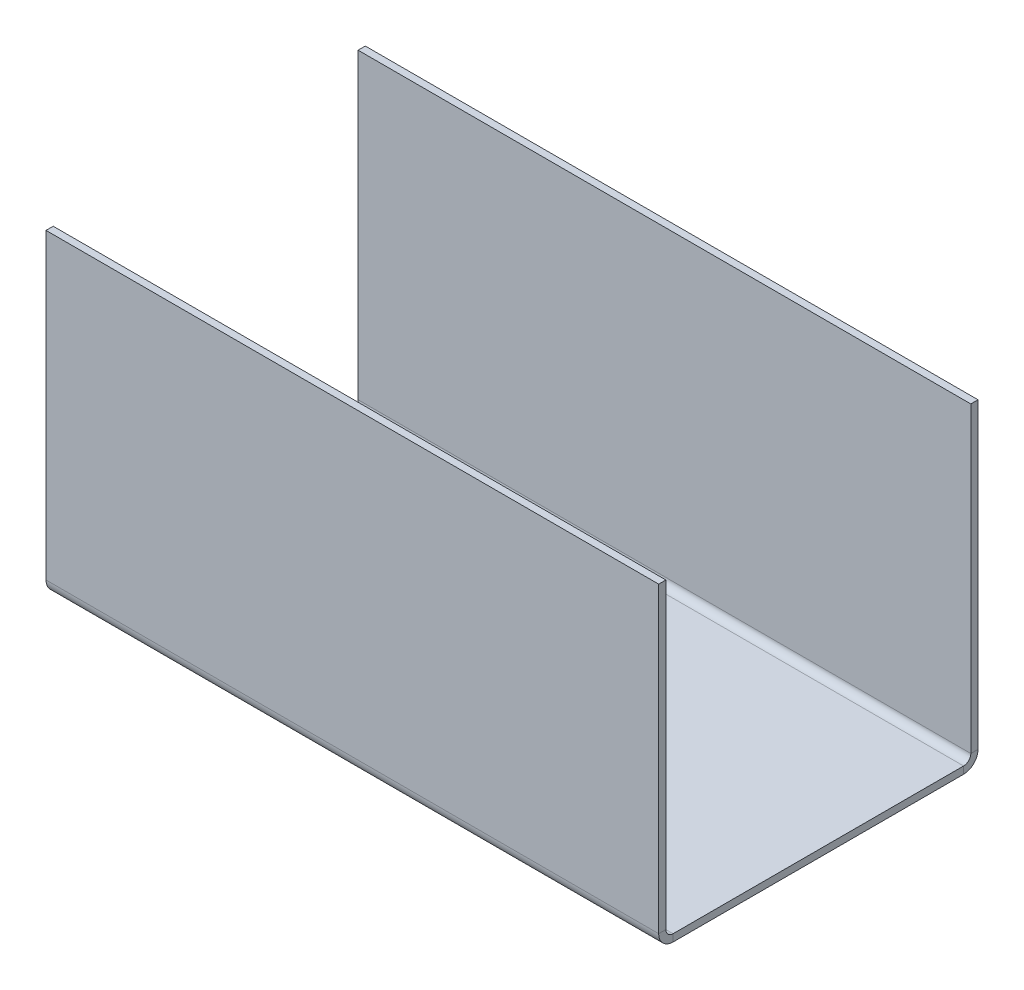
ISO-10303-21;
HEADER;
FILE_DESCRIPTION(('STEP AP214'),'2;1');
FILE_NAME('part.step','',(''),(''),'','','');
FILE_SCHEMA(('AUTOMOTIVE_DESIGN { 1 0 10303 214 1 1 1 1 }'));
ENDSEC;
DATA;
#1=APPLICATION_CONTEXT('core data for automotive mechanical design processes');
#2=APPLICATION_PROTOCOL_DEFINITION('international standard','automotive_design',2000,#1);
#3=PRODUCT_CONTEXT('',#1,'mechanical');
#4=PRODUCT('Part','Part','',(#3));
#5=PRODUCT_RELATED_PRODUCT_CATEGORY('part','',(#4));
#6=PRODUCT_DEFINITION_FORMATION('','',#4);
#7=PRODUCT_DEFINITION_CONTEXT('part definition',#1,'design');
#8=PRODUCT_DEFINITION('design','',#6,#7);
#9=PRODUCT_DEFINITION_SHAPE('','',#8);
#10=(LENGTH_UNIT() NAMED_UNIT(*) SI_UNIT(.MILLI.,.METRE.));
#11=(NAMED_UNIT(*) PLANE_ANGLE_UNIT() SI_UNIT($,.RADIAN.));
#12=(NAMED_UNIT(*) SI_UNIT($,.STERADIAN.) SOLID_ANGLE_UNIT());
#13=UNCERTAINTY_MEASURE_WITH_UNIT(LENGTH_MEASURE(1.E-05),#10,'distance_accuracy_value','');
#14=(GEOMETRIC_REPRESENTATION_CONTEXT(3) GLOBAL_UNCERTAINTY_ASSIGNED_CONTEXT((#13)) GLOBAL_UNIT_ASSIGNED_CONTEXT((#10,
#11,#12)) REPRESENTATION_CONTEXT('',''));
#15=CARTESIAN_POINT('',(0.,0.,0.));
#16=DIRECTION('',(0.,0.,1.));
#17=DIRECTION('',(1.,0.,0.));
#18=AXIS2_PLACEMENT_3D('',#15,#16,#17);
#19=CARTESIAN_POINT('',(42.5,1.,22.15));
#20=DIRECTION('',(-1.,0.,0.));
#21=DIRECTION('',(0.,0.,-1.));
#22=AXIS2_PLACEMENT_3D('',#19,#20,#21);
#23=PLANE('',#22);
#24=DIRECTION('',(0.,1.,0.));
#25=VECTOR('',#24,1.);
#26=CARTESIAN_POINT('',(42.5,1.,20.15));
#27=LINE('',#26,#25);
#28=CARTESIAN_POINT('',(42.5,0.,20.15));
#29=VERTEX_POINT('',#28);
#30=CARTESIAN_POINT('',(42.5,1.,20.15));
#31=VERTEX_POINT('',#30);
#32=EDGE_CURVE('E11',#29,#31,#27,.T.);
#33=ORIENTED_EDGE('',*,*,#32,.F.);
#34=DIRECTION('',(0.,0.,-1.));
#35=VECTOR('',#34,1.);
#36=CARTESIAN_POINT('',(42.5,0.,0.));
#37=LINE('',#36,#35);
#38=CARTESIAN_POINT('',(42.5,0.,-20.15));
#39=VERTEX_POINT('',#38);
#40=EDGE_CURVE('E151',#29,#39,#37,.T.);
#41=ORIENTED_EDGE('',*,*,#40,.T.);
#42=DIRECTION('',(0.,1.,0.));
#43=VECTOR('',#42,1.);
#44=CARTESIAN_POINT('',(42.5,1.,-20.15));
#45=LINE('',#44,#43);
#46=CARTESIAN_POINT('',(42.5,1.,-20.15));
#47=VERTEX_POINT('',#46);
#48=EDGE_CURVE('E51',#39,#47,#45,.T.);
#49=ORIENTED_EDGE('',*,*,#48,.T.);
#50=DIRECTION('',(0.,0.,-1.));
#51=VECTOR('',#50,1.);
#52=CARTESIAN_POINT('',(42.5,1.,22.15));
#53=LINE('',#52,#51);
#54=EDGE_CURVE('E256',#31,#47,#53,.T.);
#55=ORIENTED_EDGE('',*,*,#54,.F.);
#56=EDGE_LOOP('',(#33,#41,#49,#55));
#57=FACE_BOUND('',#56,.T.);
#58=ADVANCED_FACE('F41',(#57),#23,.F.);
#59=CARTESIAN_POINT('',(42.5,2.,-20.15));
#60=DIRECTION('',(-1.,0.,0.));
#61=DIRECTION('',(0.,0.,1.));
#62=AXIS2_PLACEMENT_3D('',#59,#60,#61);
#63=PLANE('',#62);
#64=ORIENTED_EDGE('',*,*,#48,.F.);
#65=CARTESIAN_POINT('',(42.5,2.,-20.15));
#66=DIRECTION('',(-1.,0.,0.));
#67=DIRECTION('',(0.,0.,1.));
#68=AXIS2_PLACEMENT_3D('',#65,#66,#67);
#69=CIRCLE('',#68,2.);
#70=CARTESIAN_POINT('',(42.5,2.,-22.15));
#71=VERTEX_POINT('',#70);
#72=EDGE_CURVE('E154',#39,#71,#69,.F.);
#73=ORIENTED_EDGE('',*,*,#72,.T.);
#74=DIRECTION('',(0.,0.,1.));
#75=VECTOR('',#74,1.);
#76=CARTESIAN_POINT('',(42.5,2.,-21.15));
#77=LINE('',#76,#75);
#78=CARTESIAN_POINT('',(42.5,2.,-21.15));
#79=VERTEX_POINT('',#78);
#80=EDGE_CURVE('E187',#71,#79,#77,.T.);
#81=ORIENTED_EDGE('',*,*,#80,.T.);
#82=CARTESIAN_POINT('',(42.5,2.,-20.15));
#83=DIRECTION('',(1.,0.,0.));
#84=DIRECTION('',(0.,0.,-1.));
#85=AXIS2_PLACEMENT_3D('',#82,#83,#84);
#86=CIRCLE('',#85,1.);
#87=EDGE_CURVE('E195',#47,#79,#86,.T.);
#88=ORIENTED_EDGE('',*,*,#87,.F.);
#89=EDGE_LOOP('',(#64,#73,#81,#88));
#90=FACE_BOUND('',#89,.T.);
#91=ADVANCED_FACE('F194',(#90),#63,.F.);
#92=CARTESIAN_POINT('',(42.5,44.,-21.15));
#93=DIRECTION('',(1.,0.,0.));
#94=DIRECTION('',(0.,-1.,0.));
#95=AXIS2_PLACEMENT_3D('',#92,#93,#94);
#96=PLANE('',#95);
#97=ORIENTED_EDGE('',*,*,#80,.F.);
#98=DIRECTION('',(0.,1.,0.));
#99=VECTOR('',#98,1.);
#100=CARTESIAN_POINT('',(42.5,44.,-22.15));
#101=LINE('',#100,#99);
#102=CARTESIAN_POINT('',(42.5,44.,-22.15));
#103=VERTEX_POINT('',#102);
#104=EDGE_CURVE('E132',#103,#71,#101,.F.);
#105=ORIENTED_EDGE('',*,*,#104,.F.);
#106=DIRECTION('',(0.,0.,1.));
#107=VECTOR('',#106,1.);
#108=CARTESIAN_POINT('',(42.5,44.,-21.15));
#109=LINE('',#108,#107);
#110=CARTESIAN_POINT('',(42.5,44.,-21.15));
#111=VERTEX_POINT('',#110);
#112=EDGE_CURVE('E184',#103,#111,#109,.T.);
#113=ORIENTED_EDGE('',*,*,#112,.T.);
#114=DIRECTION('',(0.,-1.,0.));
#115=VECTOR('',#114,1.);
#116=CARTESIAN_POINT('',(42.5,44.,-21.15));
#117=LINE('',#116,#115);
#118=EDGE_CURVE('E215',#111,#79,#117,.T.);
#119=ORIENTED_EDGE('',*,*,#118,.T.);
#120=EDGE_LOOP('',(#97,#105,#113,#119));
#121=FACE_BOUND('',#120,.T.);
#122=ADVANCED_FACE('F216',(#121),#96,.T.);
#123=CARTESIAN_POINT('',(-42.5,44.,-21.15));
#124=DIRECTION('',(0.,1.,0.));
#125=DIRECTION('',(1.,0.,0.));
#126=AXIS2_PLACEMENT_3D('',#123,#124,#125);
#127=PLANE('',#126);
#128=ORIENTED_EDGE('',*,*,#112,.F.);
#129=DIRECTION('',(-1.,0.,0.));
#130=VECTOR('',#129,1.);
#131=CARTESIAN_POINT('',(-42.5,44.,-22.15));
#132=LINE('',#131,#130);
#133=CARTESIAN_POINT('',(-42.5,44.,-22.15));
#134=VERTEX_POINT('',#133);
#135=EDGE_CURVE('E158',#134,#103,#132,.F.);
#136=ORIENTED_EDGE('',*,*,#135,.F.);
#137=DIRECTION('',(0.,0.,1.));
#138=VECTOR('',#137,1.);
#139=CARTESIAN_POINT('',(-42.5,44.,-21.15));
#140=LINE('',#139,#138);
#141=CARTESIAN_POINT('',(-42.5,44.,-21.15));
#142=VERTEX_POINT('',#141);
#143=EDGE_CURVE('E181',#134,#142,#140,.T.);
#144=ORIENTED_EDGE('',*,*,#143,.T.);
#145=DIRECTION('',(1.,0.,0.));
#146=VECTOR('',#145,1.);
#147=CARTESIAN_POINT('',(-42.5,44.,-21.15));
#148=LINE('',#147,#146);
#149=EDGE_CURVE('E220',#142,#111,#148,.T.);
#150=ORIENTED_EDGE('',*,*,#149,.T.);
#151=EDGE_LOOP('',(#128,#136,#144,#150));
#152=FACE_BOUND('',#151,.T.);
#153=ADVANCED_FACE('F252',(#152),#127,.T.);
#154=CARTESIAN_POINT('',(-42.5,44.,-21.15));
#155=DIRECTION('',(1.,0.,0.));
#156=DIRECTION('',(0.,-1.,0.));
#157=AXIS2_PLACEMENT_3D('',#154,#155,#156);
#158=PLANE('',#157);
#159=ORIENTED_EDGE('',*,*,#143,.F.);
#160=DIRECTION('',(0.,1.,0.));
#161=VECTOR('',#160,1.);
#162=CARTESIAN_POINT('',(-42.5,44.,-22.15));
#163=LINE('',#162,#161);
#164=CARTESIAN_POINT('',(-42.5,2.,-22.15));
#165=VERTEX_POINT('',#164);
#166=EDGE_CURVE('E155',#134,#165,#163,.F.);
#167=ORIENTED_EDGE('',*,*,#166,.T.);
#168=DIRECTION('',(0.,0.,1.));
#169=VECTOR('',#168,1.);
#170=CARTESIAN_POINT('',(-42.5,2.,-21.15));
#171=LINE('',#170,#169);
#172=CARTESIAN_POINT('',(-42.5,2.,-21.15));
#173=VERTEX_POINT('',#172);
#174=EDGE_CURVE('E178',#165,#173,#171,.T.);
#175=ORIENTED_EDGE('',*,*,#174,.T.);
#176=DIRECTION('',(0.,-1.,0.));
#177=VECTOR('',#176,1.);
#178=CARTESIAN_POINT('',(-42.5,44.,-21.15));
#179=LINE('',#178,#177);
#180=EDGE_CURVE('E225',#142,#173,#179,.T.);
#181=ORIENTED_EDGE('',*,*,#180,.F.);
#182=EDGE_LOOP('',(#159,#167,#175,#181));
#183=FACE_BOUND('',#182,.T.);
#184=ADVANCED_FACE('F304',(#183),#158,.F.);
#185=CARTESIAN_POINT('',(-42.5,2.,-20.15));
#186=DIRECTION('',(-1.,0.,0.));
#187=DIRECTION('',(0.,0.,1.));
#188=AXIS2_PLACEMENT_3D('',#185,#186,#187);
#189=PLANE('',#188);
#190=ORIENTED_EDGE('',*,*,#174,.F.);
#191=CARTESIAN_POINT('',(-42.5,2.,-20.15));
#192=DIRECTION('',(-1.,0.,0.));
#193=DIRECTION('',(0.,0.,1.));
#194=AXIS2_PLACEMENT_3D('',#191,#192,#193);
#195=CIRCLE('',#194,2.);
#196=CARTESIAN_POINT('',(-42.5,0.,-20.15));
#197=VERTEX_POINT('',#196);
#198=EDGE_CURVE('E148',#165,#197,#195,.T.);
#199=ORIENTED_EDGE('',*,*,#198,.T.);
#200=DIRECTION('',(0.,1.,0.));
#201=VECTOR('',#200,1.);
#202=CARTESIAN_POINT('',(-42.5,1.,-20.15));
#203=LINE('',#202,#201);
#204=CARTESIAN_POINT('',(-42.5,1.,-20.15));
#205=VERTEX_POINT('',#204);
#206=EDGE_CURVE('E176',#197,#205,#203,.T.);
#207=ORIENTED_EDGE('',*,*,#206,.T.);
#208=CARTESIAN_POINT('',(-42.5,2.,-20.15));
#209=DIRECTION('',(1.,0.,0.));
#210=DIRECTION('',(0.,0.,-1.));
#211=AXIS2_PLACEMENT_3D('',#208,#209,#210);
#212=CIRCLE('',#211,1.);
#213=EDGE_CURVE('E211',#173,#205,#212,.F.);
#214=ORIENTED_EDGE('',*,*,#213,.F.);
#215=EDGE_LOOP('',(#190,#199,#207,#214));
#216=FACE_BOUND('',#215,.T.);
#217=ADVANCED_FACE('F306',(#216),#189,.T.);
#218=CARTESIAN_POINT('',(-42.5,1.,22.15));
#219=DIRECTION('',(1.,0.,0.));
#220=DIRECTION('',(0.,0.,1.));
#221=AXIS2_PLACEMENT_3D('',#218,#219,#220);
#222=PLANE('',#221);
#223=ORIENTED_EDGE('',*,*,#206,.F.);
#224=DIRECTION('',(0.,0.,-1.));
#225=VECTOR('',#224,1.);
#226=CARTESIAN_POINT('',(-42.5,0.,0.));
#227=LINE('',#226,#225);
#228=CARTESIAN_POINT('',(-42.5,0.,20.15));
#229=VERTEX_POINT('',#228);
#230=EDGE_CURVE('E146',#197,#229,#227,.F.);
#231=ORIENTED_EDGE('',*,*,#230,.T.);
#232=DIRECTION('',(0.,1.,0.));
#233=VECTOR('',#232,1.);
#234=CARTESIAN_POINT('',(-42.5,1.,20.15));
#235=LINE('',#234,#233);
#236=CARTESIAN_POINT('',(-42.5,1.,20.15));
#237=VERTEX_POINT('',#236);
#238=EDGE_CURVE('E173',#229,#237,#235,.T.);
#239=ORIENTED_EDGE('',*,*,#238,.T.);
#240=DIRECTION('',(0.,0.,1.));
#241=VECTOR('',#240,1.);
#242=CARTESIAN_POINT('',(-42.5,1.,22.15));
#243=LINE('',#242,#241);
#244=EDGE_CURVE('E260',#205,#237,#243,.T.);
#245=ORIENTED_EDGE('',*,*,#244,.F.);
#246=EDGE_LOOP('',(#223,#231,#239,#245));
#247=FACE_BOUND('',#246,.T.);
#248=ADVANCED_FACE('F307',(#247),#222,.F.);
#249=CARTESIAN_POINT('',(-42.5,2.,20.15));
#250=DIRECTION('',(1.,0.,0.));
#251=DIRECTION('',(0.,0.,-1.));
#252=AXIS2_PLACEMENT_3D('',#249,#250,#251);
#253=PLANE('',#252);
#254=ORIENTED_EDGE('',*,*,#238,.F.);
#255=CARTESIAN_POINT('',(-42.5,2.,20.15));
#256=DIRECTION('',(1.,0.,0.));
#257=DIRECTION('',(0.,0.,-1.));
#258=AXIS2_PLACEMENT_3D('',#255,#256,#257);
#259=CIRCLE('',#258,2.);
#260=CARTESIAN_POINT('',(-42.5,2.,22.15));
#261=VERTEX_POINT('',#260);
#262=EDGE_CURVE('E133',#229,#261,#259,.F.);
#263=ORIENTED_EDGE('',*,*,#262,.T.);
#264=DIRECTION('',(0.,0.,-1.));
#265=VECTOR('',#264,1.);
#266=CARTESIAN_POINT('',(-42.5,2.,21.15));
#267=LINE('',#266,#265);
#268=CARTESIAN_POINT('',(-42.5,2.,21.15));
#269=VERTEX_POINT('',#268);
#270=EDGE_CURVE('E170',#261,#269,#267,.T.);
#271=ORIENTED_EDGE('',*,*,#270,.T.);
#272=CARTESIAN_POINT('',(-42.5,2.,20.15));
#273=DIRECTION('',(-1.,0.,0.));
#274=DIRECTION('',(0.,0.,1.));
#275=AXIS2_PLACEMENT_3D('',#272,#273,#274);
#276=CIRCLE('',#275,1.);
#277=EDGE_CURVE('E237',#237,#269,#276,.T.);
#278=ORIENTED_EDGE('',*,*,#277,.F.);
#279=EDGE_LOOP('',(#254,#263,#271,#278));
#280=FACE_BOUND('',#279,.T.);
#281=ADVANCED_FACE('F288',(#280),#253,.F.);
#282=CARTESIAN_POINT('',(-42.5,44.,21.15));
#283=DIRECTION('',(-1.,0.,0.));
#284=DIRECTION('',(0.,-1.,0.));
#285=AXIS2_PLACEMENT_3D('',#282,#283,#284);
#286=PLANE('',#285);
#287=ORIENTED_EDGE('',*,*,#270,.F.);
#288=DIRECTION('',(0.,1.,0.));
#289=VECTOR('',#288,1.);
#290=CARTESIAN_POINT('',(-42.5,44.,22.15));
#291=LINE('',#290,#289);
#292=CARTESIAN_POINT('',(-42.5,44.,22.15));
#293=VERTEX_POINT('',#292);
#294=EDGE_CURVE('E123',#293,#261,#291,.F.);
#295=ORIENTED_EDGE('',*,*,#294,.F.);
#296=DIRECTION('',(0.,0.,-1.));
#297=VECTOR('',#296,1.);
#298=CARTESIAN_POINT('',(-42.5,44.,21.15));
#299=LINE('',#298,#297);
#300=CARTESIAN_POINT('',(-42.5,44.,21.15));
#301=VERTEX_POINT('',#300);
#302=EDGE_CURVE('E167',#293,#301,#299,.T.);
#303=ORIENTED_EDGE('',*,*,#302,.T.);
#304=DIRECTION('',(0.,-1.,0.));
#305=VECTOR('',#304,1.);
#306=CARTESIAN_POINT('',(-42.5,44.,21.15));
#307=LINE('',#306,#305);
#308=EDGE_CURVE('E263',#301,#269,#307,.T.);
#309=ORIENTED_EDGE('',*,*,#308,.T.);
#310=EDGE_LOOP('',(#287,#295,#303,#309));
#311=FACE_BOUND('',#310,.T.);
#312=ADVANCED_FACE('F292',(#311),#286,.T.);
#313=CARTESIAN_POINT('',(-42.5,44.,21.15));
#314=DIRECTION('',(0.,1.,0.));
#315=DIRECTION('',(-1.,0.,0.));
#316=AXIS2_PLACEMENT_3D('',#313,#314,#315);
#317=PLANE('',#316);
#318=ORIENTED_EDGE('',*,*,#302,.F.);
#319=DIRECTION('',(1.,0.,0.));
#320=VECTOR('',#319,1.);
#321=CARTESIAN_POINT('',(-42.5,44.,22.15));
#322=LINE('',#321,#320);
#323=CARTESIAN_POINT('',(42.5,44.,22.15));
#324=VERTEX_POINT('',#323);
#325=EDGE_CURVE('E138',#324,#293,#322,.F.);
#326=ORIENTED_EDGE('',*,*,#325,.F.);
#327=DIRECTION('',(0.,0.,-1.));
#328=VECTOR('',#327,1.);
#329=CARTESIAN_POINT('',(42.5,44.,21.15));
#330=LINE('',#329,#328);
#331=CARTESIAN_POINT('',(42.5,44.,21.15));
#332=VERTEX_POINT('',#331);
#333=EDGE_CURVE('E112',#324,#332,#330,.T.);
#334=ORIENTED_EDGE('',*,*,#333,.T.);
#335=DIRECTION('',(-1.,0.,0.));
#336=VECTOR('',#335,1.);
#337=CARTESIAN_POINT('',(-42.5,44.,21.15));
#338=LINE('',#337,#336);
#339=EDGE_CURVE('E266',#332,#301,#338,.T.);
#340=ORIENTED_EDGE('',*,*,#339,.T.);
#341=EDGE_LOOP('',(#318,#326,#334,#340));
#342=FACE_BOUND('',#341,.T.);
#343=ADVANCED_FACE('F338',(#342),#317,.T.);
#344=CARTESIAN_POINT('',(42.5,44.,21.15));
#345=DIRECTION('',(-1.,0.,0.));
#346=DIRECTION('',(0.,-1.,0.));
#347=AXIS2_PLACEMENT_3D('',#344,#345,#346);
#348=PLANE('',#347);
#349=ORIENTED_EDGE('',*,*,#333,.F.);
#350=DIRECTION('',(0.,1.,0.));
#351=VECTOR('',#350,1.);
#352=CARTESIAN_POINT('',(42.5,44.,22.15));
#353=LINE('',#352,#351);
#354=CARTESIAN_POINT('',(42.5,2.,22.15));
#355=VERTEX_POINT('',#354);
#356=EDGE_CURVE('E121',#324,#355,#353,.F.);
#357=ORIENTED_EDGE('',*,*,#356,.T.);
#358=DIRECTION('',(0.,0.,-1.));
#359=VECTOR('',#358,1.);
#360=CARTESIAN_POINT('',(42.5,2.,21.15));
#361=LINE('',#360,#359);
#362=CARTESIAN_POINT('',(42.5,2.,21.15));
#363=VERTEX_POINT('',#362);
#364=EDGE_CURVE('E45',#355,#363,#361,.T.);
#365=ORIENTED_EDGE('',*,*,#364,.T.);
#366=DIRECTION('',(0.,-1.,0.));
#367=VECTOR('',#366,1.);
#368=CARTESIAN_POINT('',(42.5,44.,21.15));
#369=LINE('',#368,#367);
#370=EDGE_CURVE('E269',#332,#363,#369,.T.);
#371=ORIENTED_EDGE('',*,*,#370,.F.);
#372=EDGE_LOOP('',(#349,#357,#365,#371));
#373=FACE_BOUND('',#372,.T.);
#374=ADVANCED_FACE('F135',(#373),#348,.F.);
#375=CARTESIAN_POINT('',(42.5,2.,20.15));
#376=DIRECTION('',(1.,0.,0.));
#377=DIRECTION('',(0.,0.,-1.));
#378=AXIS2_PLACEMENT_3D('',#375,#376,#377);
#379=PLANE('',#378);
#380=CARTESIAN_POINT('',(42.5,2.,20.15));
#381=DIRECTION('',(1.,0.,0.));
#382=DIRECTION('',(0.,0.,-1.));
#383=AXIS2_PLACEMENT_3D('',#380,#381,#382);
#384=CIRCLE('',#383,2.);
#385=EDGE_CURVE('E104',#355,#29,#384,.T.);
#386=ORIENTED_EDGE('',*,*,#385,.T.);
#387=ORIENTED_EDGE('',*,*,#32,.T.);
#388=CARTESIAN_POINT('',(42.5,2.,20.15));
#389=DIRECTION('',(-1.,0.,0.));
#390=DIRECTION('',(0.,0.,1.));
#391=AXIS2_PLACEMENT_3D('',#388,#389,#390);
#392=CIRCLE('',#391,1.);
#393=EDGE_CURVE('E107',#363,#31,#392,.F.);
#394=ORIENTED_EDGE('',*,*,#393,.F.);
#395=ORIENTED_EDGE('',*,*,#364,.F.);
#396=EDGE_LOOP('',(#386,#387,#394,#395));
#397=FACE_BOUND('',#396,.T.);
#398=ADVANCED_FACE('F43',(#397),#379,.T.);
#399=CARTESIAN_POINT('',(-42.5,44.,21.15));
#400=DIRECTION('',(0.,0.,1.));
#401=DIRECTION('',(1.,0.,0.));
#402=AXIS2_PLACEMENT_3D('',#399,#400,#401);
#403=PLANE('',#402);
#404=ORIENTED_EDGE('',*,*,#370,.T.);
#405=DIRECTION('',(-1.,0.,0.));
#406=VECTOR('',#405,1.);
#407=CARTESIAN_POINT('',(-42.5,2.,21.15));
#408=LINE('',#407,#406);
#409=EDGE_CURVE('E232',#363,#269,#408,.T.);
#410=ORIENTED_EDGE('',*,*,#409,.T.);
#411=ORIENTED_EDGE('',*,*,#308,.F.);
#412=ORIENTED_EDGE('',*,*,#339,.F.);
#413=EDGE_LOOP('',(#404,#410,#411,#412));
#414=FACE_BOUND('',#413,.T.);
#415=ADVANCED_FACE('F297',(#414),#403,.F.);
#416=CARTESIAN_POINT('',(0.,1.,0.));
#417=DIRECTION('',(0.,-1.,0.));
#418=DIRECTION('',(0.,0.,-1.));
#419=AXIS2_PLACEMENT_3D('',#416,#417,#418);
#420=PLANE('',#419);
#421=ORIENTED_EDGE('',*,*,#54,.T.);
#422=DIRECTION('',(1.,0.,0.));
#423=VECTOR('',#422,1.);
#424=CARTESIAN_POINT('',(-42.5,1.,-20.15));
#425=LINE('',#424,#423);
#426=EDGE_CURVE('E113',#47,#205,#425,.F.);
#427=ORIENTED_EDGE('',*,*,#426,.T.);
#428=ORIENTED_EDGE('',*,*,#244,.T.);
#429=DIRECTION('',(-1.,0.,0.));
#430=VECTOR('',#429,1.);
#431=CARTESIAN_POINT('',(42.5,1.,20.15));
#432=LINE('',#431,#430);
#433=EDGE_CURVE('E227',#237,#31,#432,.F.);
#434=ORIENTED_EDGE('',*,*,#433,.T.);
#435=EDGE_LOOP('',(#421,#427,#428,#434));
#436=FACE_BOUND('',#435,.T.);
#437=ADVANCED_FACE('F283',(#436),#420,.F.);
#438=CARTESIAN_POINT('',(-42.5,44.,-21.15));
#439=DIRECTION('',(0.,0.,-1.));
#440=DIRECTION('',(-1.,0.,0.));
#441=AXIS2_PLACEMENT_3D('',#438,#439,#440);
#442=PLANE('',#441);
#443=ORIENTED_EDGE('',*,*,#180,.T.);
#444=DIRECTION('',(1.,0.,0.));
#445=VECTOR('',#444,1.);
#446=CARTESIAN_POINT('',(42.5,2.,-21.15));
#447=LINE('',#446,#445);
#448=EDGE_CURVE('E209',#173,#79,#447,.T.);
#449=ORIENTED_EDGE('',*,*,#448,.T.);
#450=ORIENTED_EDGE('',*,*,#118,.F.);
#451=ORIENTED_EDGE('',*,*,#149,.F.);
#452=EDGE_LOOP('',(#443,#449,#450,#451));
#453=FACE_BOUND('',#452,.T.);
#454=ADVANCED_FACE('F223',(#453),#442,.F.);
#455=CARTESIAN_POINT('',(-42.5,2.,20.15));
#456=DIRECTION('',(1.,0.,0.));
#457=DIRECTION('',(0.,0.,-1.));
#458=AXIS2_PLACEMENT_3D('',#455,#456,#457);
#459=CYLINDRICAL_SURFACE('',#458,1.);
#460=ORIENTED_EDGE('',*,*,#393,.T.);
#461=ORIENTED_EDGE('',*,*,#433,.F.);
#462=ORIENTED_EDGE('',*,*,#277,.T.);
#463=ORIENTED_EDGE('',*,*,#409,.F.);
#464=EDGE_LOOP('',(#460,#461,#462,#463));
#465=FACE_BOUND('',#464,.T.);
#466=ADVANCED_FACE('F280',(#465),#459,.F.);
#467=CARTESIAN_POINT('',(-42.5,2.,-20.15));
#468=DIRECTION('',(-1.,0.,0.));
#469=DIRECTION('',(0.,0.,1.));
#470=AXIS2_PLACEMENT_3D('',#467,#468,#469);
#471=CYLINDRICAL_SURFACE('',#470,1.);
#472=ORIENTED_EDGE('',*,*,#213,.T.);
#473=ORIENTED_EDGE('',*,*,#426,.F.);
#474=ORIENTED_EDGE('',*,*,#87,.T.);
#475=ORIENTED_EDGE('',*,*,#448,.F.);
#476=EDGE_LOOP('',(#472,#473,#474,#475));
#477=FACE_BOUND('',#476,.T.);
#478=ADVANCED_FACE('F207',(#477),#471,.F.);
#479=CARTESIAN_POINT('',(-42.5,44.,22.15));
#480=DIRECTION('',(0.,0.,1.));
#481=DIRECTION('',(1.,0.,0.));
#482=AXIS2_PLACEMENT_3D('',#479,#480,#481);
#483=PLANE('',#482);
#484=ORIENTED_EDGE('',*,*,#356,.F.);
#485=ORIENTED_EDGE('',*,*,#325,.T.);
#486=ORIENTED_EDGE('',*,*,#294,.T.);
#487=DIRECTION('',(1.,0.,0.));
#488=VECTOR('',#487,1.);
#489=CARTESIAN_POINT('',(-42.5,2.,22.15));
#490=LINE('',#489,#488);
#491=EDGE_CURVE('E118',#355,#261,#490,.F.);
#492=ORIENTED_EDGE('',*,*,#491,.F.);
#493=EDGE_LOOP('',(#484,#485,#486,#492));
#494=FACE_BOUND('',#493,.T.);
#495=ADVANCED_FACE('F119',(#494),#483,.T.);
#496=CARTESIAN_POINT('',(0.,0.,0.));
#497=DIRECTION('',(0.,-1.,0.));
#498=DIRECTION('',(0.,0.,-1.));
#499=AXIS2_PLACEMENT_3D('',#496,#497,#498);
#500=PLANE('',#499);
#501=ORIENTED_EDGE('',*,*,#40,.F.);
#502=DIRECTION('',(1.,0.,0.));
#503=VECTOR('',#502,1.);
#504=CARTESIAN_POINT('',(0.,0.,20.15));
#505=LINE('',#504,#503);
#506=EDGE_CURVE('E127',#229,#29,#505,.T.);
#507=ORIENTED_EDGE('',*,*,#506,.F.);
#508=ORIENTED_EDGE('',*,*,#230,.F.);
#509=DIRECTION('',(1.,0.,0.));
#510=VECTOR('',#509,1.);
#511=CARTESIAN_POINT('',(0.,0.,-20.15));
#512=LINE('',#511,#510);
#513=EDGE_CURVE('E212',#39,#197,#512,.F.);
#514=ORIENTED_EDGE('',*,*,#513,.F.);
#515=EDGE_LOOP('',(#501,#507,#508,#514));
#516=FACE_BOUND('',#515,.T.);
#517=ADVANCED_FACE('F309',(#516),#500,.T.);
#518=CARTESIAN_POINT('',(-42.5,44.,-22.15));
#519=DIRECTION('',(0.,0.,-1.));
#520=DIRECTION('',(-1.,0.,0.));
#521=AXIS2_PLACEMENT_3D('',#518,#519,#520);
#522=PLANE('',#521);
#523=ORIENTED_EDGE('',*,*,#166,.F.);
#524=ORIENTED_EDGE('',*,*,#135,.T.);
#525=ORIENTED_EDGE('',*,*,#104,.T.);
#526=DIRECTION('',(-1.,0.,0.));
#527=VECTOR('',#526,1.);
#528=CARTESIAN_POINT('',(-42.5,2.,-22.15));
#529=LINE('',#528,#527);
#530=EDGE_CURVE('E142',#165,#71,#529,.F.);
#531=ORIENTED_EDGE('',*,*,#530,.F.);
#532=EDGE_LOOP('',(#523,#524,#525,#531));
#533=FACE_BOUND('',#532,.T.);
#534=ADVANCED_FACE('F249',(#533),#522,.T.);
#535=CARTESIAN_POINT('',(-42.5,2.,20.15));
#536=DIRECTION('',(1.,0.,0.));
#537=DIRECTION('',(0.,0.,-1.));
#538=AXIS2_PLACEMENT_3D('',#535,#536,#537);
#539=CYLINDRICAL_SURFACE('',#538,2.);
#540=ORIENTED_EDGE('',*,*,#385,.F.);
#541=ORIENTED_EDGE('',*,*,#491,.T.);
#542=ORIENTED_EDGE('',*,*,#262,.F.);
#543=ORIENTED_EDGE('',*,*,#506,.T.);
#544=EDGE_LOOP('',(#540,#541,#542,#543));
#545=FACE_BOUND('',#544,.T.);
#546=ADVANCED_FACE('F129',(#545),#539,.T.);
#547=CARTESIAN_POINT('',(-42.5,2.,-20.15));
#548=DIRECTION('',(-1.,0.,0.));
#549=DIRECTION('',(0.,0.,1.));
#550=AXIS2_PLACEMENT_3D('',#547,#548,#549);
#551=CYLINDRICAL_SURFACE('',#550,2.);
#552=ORIENTED_EDGE('',*,*,#198,.F.);
#553=ORIENTED_EDGE('',*,*,#530,.T.);
#554=ORIENTED_EDGE('',*,*,#72,.F.);
#555=ORIENTED_EDGE('',*,*,#513,.T.);
#556=EDGE_LOOP('',(#552,#553,#554,#555));
#557=FACE_BOUND('',#556,.T.);
#558=ADVANCED_FACE('F246',(#557),#551,.T.);
#559=CLOSED_SHELL('',(#58,#91,#122,#153,#184,#217,#248,#281,#312,#343,#374,#398,#415,#437,#454,
#466,#478,#495,#517,#534,#546,#558));
#560=MANIFOLD_SOLID_BREP('B2',#559);
#561=ADVANCED_BREP_SHAPE_REPRESENTATION('',(#18,#560),#14);
#562=SHAPE_DEFINITION_REPRESENTATION(#9,#561);
ENDSEC;
END-ISO-10303-21;
